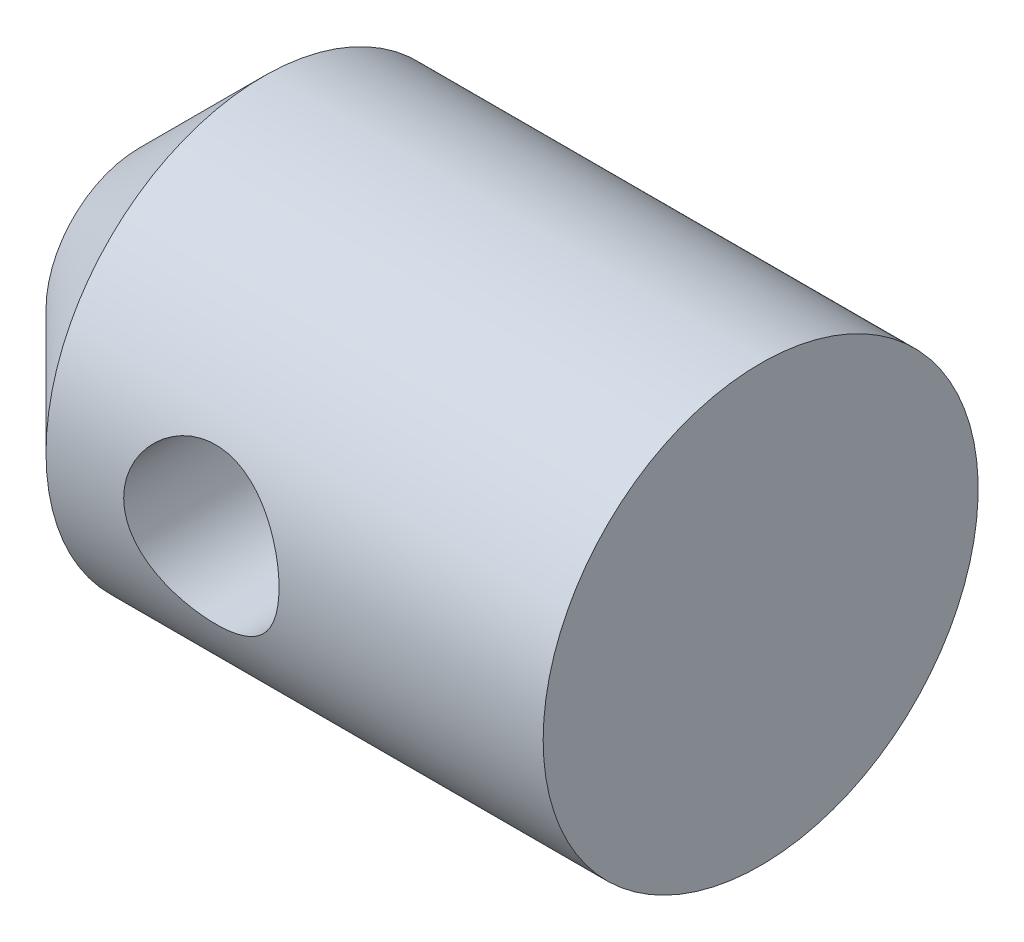
ISO-10303-21;
HEADER;
FILE_DESCRIPTION(('STEP AP214'),'2;1');
FILE_NAME('part.step','',(''),(''),'','','');
FILE_SCHEMA(('AUTOMOTIVE_DESIGN { 1 0 10303 214 1 1 1 1 }'));
ENDSEC;
DATA;
#1=APPLICATION_CONTEXT('core data for automotive mechanical design processes');
#2=APPLICATION_PROTOCOL_DEFINITION('international standard','automotive_design',2000,#1);
#3=PRODUCT_CONTEXT('',#1,'mechanical');
#4=PRODUCT('Part','Part','',(#3));
#5=PRODUCT_RELATED_PRODUCT_CATEGORY('part','',(#4));
#6=PRODUCT_DEFINITION_FORMATION('','',#4);
#7=PRODUCT_DEFINITION_CONTEXT('part definition',#1,'design');
#8=PRODUCT_DEFINITION('design','',#6,#7);
#9=PRODUCT_DEFINITION_SHAPE('','',#8);
#10=(LENGTH_UNIT() NAMED_UNIT(*) SI_UNIT(.MILLI.,.METRE.));
#11=(NAMED_UNIT(*) PLANE_ANGLE_UNIT() SI_UNIT($,.RADIAN.));
#12=(NAMED_UNIT(*) SI_UNIT($,.STERADIAN.) SOLID_ANGLE_UNIT());
#13=UNCERTAINTY_MEASURE_WITH_UNIT(LENGTH_MEASURE(1.E-05),#10,'distance_accuracy_value','');
#14=(GEOMETRIC_REPRESENTATION_CONTEXT(3) GLOBAL_UNCERTAINTY_ASSIGNED_CONTEXT((#13)) GLOBAL_UNIT_ASSIGNED_CONTEXT((#10,
#11,#12)) REPRESENTATION_CONTEXT('',''));
#15=CARTESIAN_POINT('',(0.,0.,0.));
#16=DIRECTION('',(0.,0.,1.));
#17=DIRECTION('',(1.,0.,0.));
#18=AXIS2_PLACEMENT_3D('',#15,#16,#17);
#19=CARTESIAN_POINT('',(3.99999999999998,0.,0.));
#20=DIRECTION('',(1.,0.,0.));
#21=DIRECTION('',(0.,0.,-1.));
#22=AXIS2_PLACEMENT_3D('',#19,#20,#21);
#23=CONICAL_SURFACE('',#22,7.,0.78539816339745);
#24=CARTESIAN_POINT('',(0.,0.,0.));
#25=DIRECTION('',(-1.,0.,0.));
#26=DIRECTION('',(0.,0.,1.));
#27=AXIS2_PLACEMENT_3D('',#24,#25,#26);
#28=CIRCLE('',#27,3.);
#29=CARTESIAN_POINT('',(0.,0.,3.));
#30=VERTEX_POINT('',#29);
#31=EDGE_CURVE('E10',#30,#30,#28,.T.);
#32=ORIENTED_EDGE('',*,*,#31,.F.);
#33=EDGE_LOOP('',(#32));
#34=FACE_BOUND('',#33,.T.);
#35=CARTESIAN_POINT('',(3.99999999999998,0.,0.));
#36=DIRECTION('',(-1.,0.,0.));
#37=DIRECTION('',(0.,0.,1.));
#38=AXIS2_PLACEMENT_3D('',#35,#36,#37);
#39=CIRCLE('',#38,7.);
#40=CARTESIAN_POINT('',(3.99999999999998,0.,7.));
#41=VERTEX_POINT('',#40);
#42=EDGE_CURVE('E47',#41,#41,#39,.T.);
#43=ORIENTED_EDGE('',*,*,#42,.T.);
#44=EDGE_LOOP('',(#43));
#45=FACE_BOUND('',#44,.T.);
#46=ADVANCED_FACE('F30',(#34,#45),#23,.T.);
#47=CARTESIAN_POINT('',(0.,3.,0.));
#48=DIRECTION('',(1.,0.,0.));
#49=DIRECTION('',(0.,0.,-1.));
#50=AXIS2_PLACEMENT_3D('',#47,#48,#49);
#51=PLANE('',#50);
#52=CARTESIAN_POINT('',(0.,0.,0.));
#53=DIRECTION('',(-1.,0.,0.));
#54=DIRECTION('',(0.,0.,1.));
#55=AXIS2_PLACEMENT_3D('',#52,#53,#54);
#56=CIRCLE('',#55,1.);
#57=CARTESIAN_POINT('',(0.,0.,1.));
#58=VERTEX_POINT('',#57);
#59=EDGE_CURVE('E97',#58,#58,#56,.T.);
#60=ORIENTED_EDGE('',*,*,#59,.F.);
#61=EDGE_LOOP('',(#60));
#62=FACE_BOUND('',#61,.T.);
#63=ORIENTED_EDGE('',*,*,#31,.T.);
#64=EDGE_LOOP('',(#63));
#65=FACE_BOUND('',#64,.T.);
#66=ADVANCED_FACE('F87',(#62,#65),#51,.F.);
#67=CARTESIAN_POINT('',(20.,0.,0.));
#68=DIRECTION('',(-1.,0.,0.));
#69=DIRECTION('',(0.,0.,1.));
#70=AXIS2_PLACEMENT_3D('',#67,#68,#69);
#71=PLANE('',#70);
#72=CARTESIAN_POINT('',(20.,0.,0.));
#73=DIRECTION('',(-1.,0.,0.));
#74=DIRECTION('',(0.,0.,1.));
#75=AXIS2_PLACEMENT_3D('',#72,#73,#74);
#76=CIRCLE('',#75,7.);
#77=CARTESIAN_POINT('',(20.,0.,7.));
#78=VERTEX_POINT('',#77);
#79=EDGE_CURVE('E42',#78,#78,#76,.T.);
#80=ORIENTED_EDGE('',*,*,#79,.F.);
#81=EDGE_LOOP('',(#80));
#82=FACE_BOUND('',#81,.T.);
#83=ADVANCED_FACE('F83',(#82),#71,.F.);
#84=CARTESIAN_POINT('',(0.,0.,0.));
#85=DIRECTION('',(-1.,0.,0.));
#86=DIRECTION('',(0.,0.,1.));
#87=AXIS2_PLACEMENT_3D('',#84,#85,#86);
#88=CYLINDRICAL_SURFACE('',#87,7.);
#89=CARTESIAN_POINT('',(11.5,0.,7.));
#90=CARTESIAN_POINT('',(11.5000028240418,-0.135839760518735,7.0000020295295));
#91=CARTESIAN_POINT('',(11.4888932427672,-0.271659429947531,6.99601056603649));
#92=CARTESIAN_POINT('',(11.4449087128079,-0.539264896606897,6.98048404948616));
#93=CARTESIAN_POINT('',(11.4120345949352,-0.671050847614628,6.96894928437749));
#94=CARTESIAN_POINT('',(11.3258148587325,-0.926692116674317,6.93958109810981));
#95=CARTESIAN_POINT('',(11.27250644028,-1.05056137145919,6.92175912724346));
#96=CARTESIAN_POINT('',(11.1471112806324,-1.28759585298401,6.88161078032354));
#97=CARTESIAN_POINT('',(11.075020040551,-1.40075850640075,6.85928332539979));
#98=CARTESIAN_POINT('',(10.9111568678836,-1.61758802805346,6.81147377429754));
#99=CARTESIAN_POINT('',(10.8187812689946,-1.72078015672851,6.78590827445072));
#100=CARTESIAN_POINT('',(10.6182536362102,-1.9105819932243,6.73493522536265));
#101=CARTESIAN_POINT('',(10.5100974162836,-1.99718728701346,6.70952771990193));
#102=CARTESIAN_POINT('',(10.2766022072243,-2.15423735561842,6.6608007016897));
#103=CARTESIAN_POINT('',(10.1508052564835,-2.2240352979483,6.63758107761794));
#104=CARTESIAN_POINT('',(9.88829633529564,-2.34127572230003,6.59714352451506));
#105=CARTESIAN_POINT('',(9.75158828543227,-2.38872619231546,6.57992345154766));
#106=CARTESIAN_POINT('',(9.47657716379751,-2.45809130448528,6.55432038222057));
#107=CARTESIAN_POINT('',(9.33853069305687,-2.48090519407331,6.54562733379002));
#108=CARTESIAN_POINT('',(9.06031636817618,-2.5031615222748,6.53715061879805));
#109=CARTESIAN_POINT('',(8.92014930745843,-2.50261249605974,6.53736369856128));
#110=CARTESIAN_POINT('',(8.64964434494749,-2.4788507897233,6.54640588297195));
#111=CARTESIAN_POINT('',(8.51918164700024,-2.45685161763648,6.55477363669039));
#112=CARTESIAN_POINT('',(8.26393847281664,-2.3928085105506,6.57842082174382));
#113=CARTESIAN_POINT('',(8.13915877534919,-2.35076183734614,6.59370119723067));
#114=CARTESIAN_POINT('',(7.89622625421427,-2.247095668441,6.62975170487814));
#115=CARTESIAN_POINT('',(7.77823039734145,-2.18514195933256,6.65061447775042));
#116=CARTESIAN_POINT('',(7.55394361335027,-2.04365272690694,6.69544469696369));
#117=CARTESIAN_POINT('',(7.44765646669257,-1.96411154980233,6.71941314064672));
#118=CARTESIAN_POINT('',(7.24304040862885,-1.78403149047107,6.76952498465894));
#119=CARTESIAN_POINT('',(7.14558214075083,-1.68251331515438,6.7957122347435));
#120=CARTESIAN_POINT('',(6.9688283171652,-1.46426184534914,6.84605473605515));
#121=CARTESIAN_POINT('',(6.88953505770122,-1.3475266301937,6.87020973014028));
#122=CARTESIAN_POINT('',(6.75051939006078,-1.10010034292175,6.91416998722002));
#123=CARTESIAN_POINT('',(6.6910617601102,-0.96924911242521,6.93391532170414));
#124=CARTESIAN_POINT('',(6.59528417583962,-0.698523468127248,6.96639167687355));
#125=CARTESIAN_POINT('',(6.55895493923736,-0.558652699053767,6.97912551125634));
#126=CARTESIAN_POINT('',(6.5120808493404,-0.281205091813834,6.99566202632136));
#127=CARTESIAN_POINT('',(6.50036186925433,-0.143850613169093,6.99987103999093));
#128=CARTESIAN_POINT('',(6.49965487800976,0.130909371573393,7.00012297890716));
#129=CARTESIAN_POINT('',(6.5106623730082,0.26831486221267,6.99616751856457));
#130=CARTESIAN_POINT('',(6.55418613732156,0.534368698997769,6.98080349995239));
#131=CARTESIAN_POINT('',(6.58595475579813,0.663155848081399,6.96965417819419));
#132=CARTESIAN_POINT('',(6.66913659473604,0.913499444029993,6.94128245796678));
#133=CARTESIAN_POINT('',(6.72055236582855,1.03505494970017,6.9240592709991));
#134=CARTESIAN_POINT('',(6.84315885340159,1.27131790851501,6.88465739573328));
#135=CARTESIAN_POINT('',(6.91486648049935,1.38573546298722,6.86235262462323));
#136=CARTESIAN_POINT('',(7.07542749510743,1.6012793689737,6.81528395513799));
#137=CARTESIAN_POINT('',(7.16428676477382,1.70240114063959,6.79051921453451));
#138=CARTESIAN_POINT('',(7.3621296327289,1.89402292059753,6.73966040960453));
#139=CARTESIAN_POINT('',(7.47192471301965,1.98368681906969,6.71356479866296));
#140=CARTESIAN_POINT('',(7.70554127000433,2.14345525781598,6.6642787599771));
#141=CARTESIAN_POINT('',(7.82936343112859,2.21355884309556,6.64108847411013));
#142=CARTESIAN_POINT('',(8.08806480923604,2.33208686094212,6.60040332956606));
#143=CARTESIAN_POINT('',(8.22295567050984,2.3804881075604,6.58291456759544));
#144=CARTESIAN_POINT('',(8.49976010072008,2.45361419016747,6.55601442004241));
#145=CARTESIAN_POINT('',(8.6416698206623,2.4783518546378,6.54659865821928));
#146=CARTESIAN_POINT('',(8.91952047937298,2.50236255506862,6.53745596427834));
#147=CARTESIAN_POINT('',(9.05532321442439,2.50304426978182,6.53719306756498));
#148=CARTESIAN_POINT('',(9.32499767065487,2.48247035008869,6.54503319463772));
#149=CARTESIAN_POINT('',(9.45886954124813,2.46121642244208,6.55313556754228));
#150=CARTESIAN_POINT('',(9.71750058537184,2.39843007607193,6.57636700427785));
#151=CARTESIAN_POINT('',(9.84240409900577,2.35741961008936,6.59131474248996));
#152=CARTESIAN_POINT('',(10.0836426818669,2.25672644338171,6.62646329315119));
#153=CARTESIAN_POINT('',(10.1999756809442,2.19703924956895,6.64666536944648));
#154=CARTESIAN_POINT('',(10.4269257499522,2.05730313071904,6.69127230994832));
#155=CARTESIAN_POINT('',(10.5369880408629,1.97640371595173,6.71583400336863));
#156=CARTESIAN_POINT('',(10.7424275046605,1.79790863011924,6.76580411328317));
#157=CARTESIAN_POINT('',(10.837800220351,1.70030791033581,6.79121278393859));
#158=CARTESIAN_POINT('',(11.0157219028165,1.48566252339524,6.84145445667706));
#159=CARTESIAN_POINT('',(11.0974530397909,1.36791750616705,6.86620367070764));
#160=CARTESIAN_POINT('',(11.2399076638379,1.11951131249464,6.91104924401845));
#161=CARTESIAN_POINT('',(11.3006327402027,0.988851114158938,6.93114595526313));
#162=CARTESIAN_POINT('',(11.3991403103086,0.717646336524984,6.96446006180832));
#163=CARTESIAN_POINT('',(11.4368254081626,0.577062560467784,6.97764821973896));
#164=CARTESIAN_POINT('',(11.4872488746388,0.290976881134822,6.99541542277591));
#165=CARTESIAN_POINT('',(11.4999969756063,0.145476919097827,6.99999782648543));
#166=CARTESIAN_POINT('',(11.5,0.,7.));
#167=B_SPLINE_CURVE_WITH_KNOTS('',3,(#89,#90,#91,#92,#93,#94,#95,#96,#97,#98,#99,#100,#101,#102,
#103,#104,#105,#106,#107,#108,#109,#110,#111,#112,#113,#114,#115,#116,#117,#118,#119,#120,#121,
#122,#123,#124,#125,#126,#127,#128,#129,#130,#131,#132,#133,#134,#135,#136,#137,#138,#139,#140,
#141,#142,#143,#144,#145,#146,#147,#148,#149,#150,#151,#152,#153,#154,#155,#156,#157,#158,#159,
#160,#161,#162,#163,#164,#165,#166),.UNSPECIFIED.,.T.,.F.,(4,2,2,2,2,2,2,2,2,2,2,2,2,2,2,2,2,2,
2,2,2,2,2,2,2,2,2,2,2,2,2,2,2,2,2,2,2,2,4),(0.,0.406983217142953,0.813950899519932,
1.22018120425629,1.62650889940498,2.04714572459521,2.46789433314937,2.90289606780334,
3.3377421950035,3.75611562378725,4.17433620956451,4.57019246497947,4.96610280426156,
5.36904149669469,5.77210990935867,6.19956653135137,6.62707715847137,7.06008524763626,
7.49291944485573,7.90458529912081,8.31616976000825,8.71369326802826,9.11126840085791,
9.52005856953122,9.92898918269314,10.3593838463852,10.7897995195909,11.2206739431307,
11.6513146487841,12.0566930957309,12.4620400035307,12.8572208236401,13.2524967861626,
13.6670344525245,14.0816976535747,14.5159343578492,14.9501382011315,15.3861650682914,
15.8220217300551),.UNSPECIFIED.);
#168=CARTESIAN_POINT('',(11.5,0.,7.));
#169=VERTEX_POINT('',#168);
#170=EDGE_CURVE('E69',#169,#169,#167,.T.);
#171=ORIENTED_EDGE('',*,*,#170,.T.);
#172=EDGE_LOOP('',(#171));
#173=FACE_BOUND('',#172,.T.);
#174=CARTESIAN_POINT('',(11.5,0.,-7.));
#175=CARTESIAN_POINT('',(11.5000028240418,0.135839760518735,-7.0000020295295));
#176=CARTESIAN_POINT('',(11.4888932427672,0.271659429947531,-6.99601056603649));
#177=CARTESIAN_POINT('',(11.4449087128079,0.539264896606897,-6.98048404948616));
#178=CARTESIAN_POINT('',(11.4120345949352,0.671050847614628,-6.96894928437749));
#179=CARTESIAN_POINT('',(11.3258148587325,0.926692116674317,-6.93958109810981));
#180=CARTESIAN_POINT('',(11.27250644028,1.05056137145919,-6.92175912724346));
#181=CARTESIAN_POINT('',(11.1471112806324,1.28759585298401,-6.88161078032354));
#182=CARTESIAN_POINT('',(11.075020040551,1.40075850640075,-6.85928332539979));
#183=CARTESIAN_POINT('',(10.9111568678836,1.61758802805346,-6.81147377429754));
#184=CARTESIAN_POINT('',(10.8187812689946,1.72078015672851,-6.78590827445072));
#185=CARTESIAN_POINT('',(10.6182536362102,1.9105819932243,-6.73493522536265));
#186=CARTESIAN_POINT('',(10.5100974162836,1.99718728701346,-6.70952771990193));
#187=CARTESIAN_POINT('',(10.2766022072243,2.15423735561842,-6.6608007016897));
#188=CARTESIAN_POINT('',(10.1508052564835,2.2240352979483,-6.63758107761794));
#189=CARTESIAN_POINT('',(9.88829633529564,2.34127572230003,-6.59714352451506));
#190=CARTESIAN_POINT('',(9.75158828543227,2.38872619231546,-6.57992345154766));
#191=CARTESIAN_POINT('',(9.47657716379751,2.45809130448528,-6.55432038222057));
#192=CARTESIAN_POINT('',(9.33853069305687,2.48090519407331,-6.54562733379002));
#193=CARTESIAN_POINT('',(9.06031636817618,2.5031615222748,-6.53715061879805));
#194=CARTESIAN_POINT('',(8.92014930745843,2.50261249605974,-6.53736369856128));
#195=CARTESIAN_POINT('',(8.64964434494749,2.4788507897233,-6.54640588297195));
#196=CARTESIAN_POINT('',(8.51918164700024,2.45685161763648,-6.55477363669039));
#197=CARTESIAN_POINT('',(8.26393847281664,2.3928085105506,-6.57842082174382));
#198=CARTESIAN_POINT('',(8.13915877534919,2.35076183734614,-6.59370119723067));
#199=CARTESIAN_POINT('',(7.89622625421427,2.247095668441,-6.62975170487814));
#200=CARTESIAN_POINT('',(7.77823039734145,2.18514195933256,-6.65061447775042));
#201=CARTESIAN_POINT('',(7.55394361335027,2.04365272690694,-6.69544469696369));
#202=CARTESIAN_POINT('',(7.44765646669257,1.96411154980233,-6.71941314064672));
#203=CARTESIAN_POINT('',(7.24304040862885,1.78403149047107,-6.76952498465894));
#204=CARTESIAN_POINT('',(7.14558214075083,1.68251331515438,-6.7957122347435));
#205=CARTESIAN_POINT('',(6.9688283171652,1.46426184534914,-6.84605473605515));
#206=CARTESIAN_POINT('',(6.88953505770122,1.3475266301937,-6.87020973014028));
#207=CARTESIAN_POINT('',(6.75051939006078,1.10010034292175,-6.91416998722002));
#208=CARTESIAN_POINT('',(6.6910617601102,0.96924911242521,-6.93391532170414));
#209=CARTESIAN_POINT('',(6.59528417583962,0.698523468127248,-6.96639167687355));
#210=CARTESIAN_POINT('',(6.55895493923736,0.558652699053767,-6.97912551125634));
#211=CARTESIAN_POINT('',(6.5120808493404,0.281205091813834,-6.99566202632136));
#212=CARTESIAN_POINT('',(6.50036186925433,0.143850613169093,-6.99987103999093));
#213=CARTESIAN_POINT('',(6.49965487800976,-0.130909371573393,-7.00012297890716));
#214=CARTESIAN_POINT('',(6.5106623730082,-0.26831486221267,-6.99616751856457));
#215=CARTESIAN_POINT('',(6.55418613732156,-0.534368698997769,-6.98080349995239));
#216=CARTESIAN_POINT('',(6.58595475579813,-0.663155848081399,-6.96965417819419));
#217=CARTESIAN_POINT('',(6.66913659473604,-0.913499444029993,-6.94128245796678));
#218=CARTESIAN_POINT('',(6.72055236582855,-1.03505494970017,-6.9240592709991));
#219=CARTESIAN_POINT('',(6.84315885340159,-1.27131790851501,-6.88465739573328));
#220=CARTESIAN_POINT('',(6.91486648049935,-1.38573546298722,-6.86235262462323));
#221=CARTESIAN_POINT('',(7.07542749510743,-1.6012793689737,-6.81528395513799));
#222=CARTESIAN_POINT('',(7.16428676477382,-1.70240114063959,-6.79051921453451));
#223=CARTESIAN_POINT('',(7.3621296327289,-1.89402292059753,-6.73966040960453));
#224=CARTESIAN_POINT('',(7.47192471301965,-1.98368681906969,-6.71356479866296));
#225=CARTESIAN_POINT('',(7.70554127000433,-2.14345525781598,-6.6642787599771));
#226=CARTESIAN_POINT('',(7.82936343112859,-2.21355884309556,-6.64108847411013));
#227=CARTESIAN_POINT('',(8.08806480923604,-2.33208686094212,-6.60040332956606));
#228=CARTESIAN_POINT('',(8.22295567050984,-2.3804881075604,-6.58291456759544));
#229=CARTESIAN_POINT('',(8.49976010072008,-2.45361419016747,-6.55601442004241));
#230=CARTESIAN_POINT('',(8.6416698206623,-2.4783518546378,-6.54659865821928));
#231=CARTESIAN_POINT('',(8.91952047937298,-2.50236255506862,-6.53745596427834));
#232=CARTESIAN_POINT('',(9.05532321442439,-2.50304426978182,-6.53719306756498));
#233=CARTESIAN_POINT('',(9.32499767065487,-2.48247035008869,-6.54503319463772));
#234=CARTESIAN_POINT('',(9.45886954124813,-2.46121642244208,-6.55313556754228));
#235=CARTESIAN_POINT('',(9.71750058537184,-2.39843007607193,-6.57636700427785));
#236=CARTESIAN_POINT('',(9.84240409900577,-2.35741961008936,-6.59131474248996));
#237=CARTESIAN_POINT('',(10.0836426818669,-2.25672644338171,-6.62646329315119));
#238=CARTESIAN_POINT('',(10.1999756809442,-2.19703924956895,-6.64666536944648));
#239=CARTESIAN_POINT('',(10.4269257499522,-2.05730313071904,-6.69127230994832));
#240=CARTESIAN_POINT('',(10.5369880408629,-1.97640371595173,-6.71583400336863));
#241=CARTESIAN_POINT('',(10.7424275046605,-1.79790863011924,-6.76580411328317));
#242=CARTESIAN_POINT('',(10.837800220351,-1.70030791033581,-6.79121278393859));
#243=CARTESIAN_POINT('',(11.0157219028165,-1.48566252339524,-6.84145445667706));
#244=CARTESIAN_POINT('',(11.0974530397909,-1.36791750616705,-6.86620367070764));
#245=CARTESIAN_POINT('',(11.2399076638379,-1.11951131249464,-6.91104924401845));
#246=CARTESIAN_POINT('',(11.3006327402027,-0.988851114158938,-6.93114595526313));
#247=CARTESIAN_POINT('',(11.3991403103086,-0.717646336524984,-6.96446006180832));
#248=CARTESIAN_POINT('',(11.4368254081626,-0.577062560467784,-6.97764821973896));
#249=CARTESIAN_POINT('',(11.4872488746388,-0.290976881134822,-6.99541542277591));
#250=CARTESIAN_POINT('',(11.4999969756063,-0.145476919097827,-6.99999782648543));
#251=CARTESIAN_POINT('',(11.5,0.,-7.));
#252=B_SPLINE_CURVE_WITH_KNOTS('',3,(#174,#175,#176,#177,#178,#179,#180,#181,#182,#183,#184,
#185,#186,#187,#188,#189,#190,#191,#192,#193,#194,#195,#196,#197,#198,#199,#200,#201,#202,#203,
#204,#205,#206,#207,#208,#209,#210,#211,#212,#213,#214,#215,#216,#217,#218,#219,#220,#221,#222,
#223,#224,#225,#226,#227,#228,#229,#230,#231,#232,#233,#234,#235,#236,#237,#238,#239,#240,#241,
#242,#243,#244,#245,#246,#247,#248,#249,#250,#251),.UNSPECIFIED.,.T.,.F.,(4,2,2,2,2,2,2,2,2,2,2,
2,2,2,2,2,2,2,2,2,2,2,2,2,2,2,2,2,2,2,2,2,2,2,2,2,2,2,4),(0.,0.406983217142953,
0.813950899519932,1.22018120425629,1.62650889940498,2.04714572459521,2.46789433314937,
2.90289606780334,3.3377421950035,3.75611562378725,4.17433620956451,4.57019246497947,
4.96610280426156,5.36904149669469,5.77210990935867,6.19956653135137,6.62707715847137,
7.06008524763626,7.49291944485573,7.90458529912081,8.31616976000825,8.71369326802826,
9.11126840085791,9.52005856953122,9.92898918269314,10.3593838463852,10.7897995195909,
11.2206739431307,11.6513146487841,12.0566930957309,12.4620400035307,12.8572208236401,
13.2524967861626,13.6670344525245,14.0816976535747,14.5159343578492,14.9501382011315,
15.3861650682914,15.8220217300551),.UNSPECIFIED.);
#253=CARTESIAN_POINT('',(11.5,0.,-7.));
#254=VERTEX_POINT('',#253);
#255=EDGE_CURVE('E74',#254,#254,#252,.T.);
#256=ORIENTED_EDGE('',*,*,#255,.T.);
#257=EDGE_LOOP('',(#256));
#258=FACE_BOUND('',#257,.T.);
#259=ORIENTED_EDGE('',*,*,#42,.F.);
#260=EDGE_LOOP('',(#259));
#261=FACE_BOUND('',#260,.T.);
#262=ORIENTED_EDGE('',*,*,#79,.T.);
#263=EDGE_LOOP('',(#262));
#264=FACE_BOUND('',#263,.T.);
#265=ADVANCED_FACE('F79',(#173,#258,#261,#264),#88,.T.);
#266=CARTESIAN_POINT('',(15.,0.,0.));
#267=DIRECTION('',(-1.,0.,0.));
#268=DIRECTION('',(0.,0.,1.));
#269=AXIS2_PLACEMENT_3D('',#266,#267,#268);
#270=CYLINDRICAL_SURFACE('',#269,1.);
#271=CARTESIAN_POINT('',(6.49999999999998,0.,1.));
#272=CARTESIAN_POINT('',(6.50000364386456,-0.0537465027214457,0.999995074088137));
#273=CARTESIAN_POINT('',(6.50175352846532,-0.107586282045337,0.995641123955812));
#274=CARTESIAN_POINT('',(6.50858273449677,-0.213748240208948,0.978376148239382));
#275=CARTESIAN_POINT('',(6.51367110650559,-0.266065888780624,0.965441860456933));
#276=CARTESIAN_POINT('',(6.52662895393439,-0.367476961363701,0.931561960970584));
#277=CARTESIAN_POINT('',(6.53448931817962,-0.416580330808479,0.910642576891635));
#278=CARTESIAN_POINT('',(6.55221694601959,-0.510535985164184,0.861490413336727));
#279=CARTESIAN_POINT('',(6.5620835127097,-0.555389738375496,0.833260172540535));
#280=CARTESIAN_POINT('',(6.58334556914789,-0.641750503785197,0.768882250719531));
#281=CARTESIAN_POINT('',(6.59478851535403,-0.683031136275106,0.732446671879868));
#282=CARTESIAN_POINT('',(6.61769711546901,-0.759087502392361,0.653299998261611));
#283=CARTESIAN_POINT('',(6.62916277773102,-0.793860053566766,0.610585851394129));
#284=CARTESIAN_POINT('',(6.6513860410143,-0.857437283646439,0.517785964878867));
#285=CARTESIAN_POINT('',(6.66208942017522,-0.885907490597737,0.467456756988401));
#286=CARTESIAN_POINT('',(6.68083176406602,-0.933877359518574,0.362231800789979));
#287=CARTESIAN_POINT('',(6.6888719937791,-0.953381282142917,0.30733823607582));
#288=CARTESIAN_POINT('',(6.70086821169589,-0.981949411697934,0.197143833203949));
#289=CARTESIAN_POINT('',(6.70499289822196,-0.991446982902824,0.141974382211893));
#290=CARTESIAN_POINT('',(6.70917997975426,-1.00108648082001,0.030682500846366));
#291=CARTESIAN_POINT('',(6.70924437238614,-1.00123300815661,-0.0254394473125076));
#292=CARTESIAN_POINT('',(6.70544749860001,-0.992494683752272,-0.132878335729022));
#293=CARTESIAN_POINT('',(6.70185912480773,-0.984237657152568,-0.184257857204515));
#294=CARTESIAN_POINT('',(6.6916190619608,-0.95997344014891,-0.284829778003357));
#295=CARTESIAN_POINT('',(6.68496683839162,-0.943964897402315,-0.334021794055154));
#296=CARTESIAN_POINT('',(6.66920257455733,-0.904347366275536,-0.430008918098021));
#297=CARTESIAN_POINT('',(6.66004310359604,-0.880589931157658,-0.476734619527345));
#298=CARTESIAN_POINT('',(6.64030941805053,-0.826253230366107,-0.565707908180782));
#299=CARTESIAN_POINT('',(6.62973467271574,-0.795671402550422,-0.607953804701403));
#300=CARTESIAN_POINT('',(6.60736631628863,-0.725775299727216,-0.690204864400999));
#301=CARTESIAN_POINT('',(6.59554167511922,-0.685968731485317,-0.729784364723008));
#302=CARTESIAN_POINT('',(6.57270087520857,-0.600157213715096,-0.80184223900102));
#303=CARTESIAN_POINT('',(6.56168487777336,-0.554151032667216,-0.834319198705147));
#304=CARTESIAN_POINT('',(6.54142659367724,-0.456038826302921,-0.891808723707917));
#305=CARTESIAN_POINT('',(6.53222364952291,-0.403830245673238,-0.916661140598527));
#306=CARTESIAN_POINT('',(6.51692585835619,-0.29551188274144,-0.957083930539028));
#307=CARTESIAN_POINT('',(6.51082943268807,-0.239404098424837,-0.972659018778705));
#308=CARTESIAN_POINT('',(6.50271930246543,-0.12844794380391,-0.993224147709852));
#309=CARTESIAN_POINT('',(6.50048527083241,-0.073721646992767,-0.99878622712678));
#310=CARTESIAN_POINT('',(6.49965760744683,0.0359226549039089,-1.00085655026431));
#311=CARTESIAN_POINT('',(6.50106303208852,0.0908406066119622,-0.997367140773755));
#312=CARTESIAN_POINT('',(6.50721216468122,0.196716369560994,-0.981854123724004));
#313=CARTESIAN_POINT('',(6.51180304327236,0.247741245887737,-0.970221009824512));
#314=CARTESIAN_POINT('',(6.52370279297248,0.34706771403039,-0.939282145845093));
#315=CARTESIAN_POINT('',(6.53101201321733,0.395368955112423,-0.91997541016566));
#316=CARTESIAN_POINT('',(6.54791702614592,0.489539392908351,-0.873607530160025));
#317=CARTESIAN_POINT('',(6.55757592010096,0.535289011377703,-0.846327263978426));
#318=CARTESIAN_POINT('',(6.57813317627236,0.621721795623278,-0.785029838047178));
#319=CARTESIAN_POINT('',(6.58903203444863,0.662402920380563,-0.751009978538693));
#320=CARTESIAN_POINT('',(6.61177441180942,0.740361521514409,-0.674564993525186));
#321=CARTESIAN_POINT('',(6.62363279287472,0.777236966903032,-0.631733229246896));
#322=CARTESIAN_POINT('',(6.64629163541432,0.843375598706856,-0.540279958495316));
#323=CARTESIAN_POINT('',(6.65709192236743,0.872637530668755,-0.491657499830025));
#324=CARTESIAN_POINT('',(6.67642850046144,0.922903750965814,-0.389269152702947));
#325=CARTESIAN_POINT('',(6.68494184557604,0.943825297267227,-0.335458000393844));
#326=CARTESIAN_POINT('',(6.69838163261032,0.976148109852652,-0.224633174142422));
#327=CARTESIAN_POINT('',(6.70331072151999,0.987556402634658,-0.167621897093787));
#328=CARTESIAN_POINT('',(6.70864120350035,0.999857808639201,-0.0564360491127282));
#329=CARTESIAN_POINT('',(6.70934289495912,1.00144854115143,-0.00235258020332416));
#330=CARTESIAN_POINT('',(6.70692581983449,0.995901579638762,0.105272428856647));
#331=CARTESIAN_POINT('',(6.70380753837601,0.988764993956891,0.158814036951292));
#332=CARTESIAN_POINT('',(6.69436675460488,0.966535683076824,0.261666094927521));
#333=CARTESIAN_POINT('',(6.68817584086273,0.951768746785489,0.3110601372165));
#334=CARTESIAN_POINT('',(6.6733799938365,0.915002724245506,0.406689314806741));
#335=CARTESIAN_POINT('',(6.66477439396995,0.893001640696907,0.452923573449913));
#336=CARTESIAN_POINT('',(6.64550695197752,0.840936381379865,0.543804809635389));
#337=CARTESIAN_POINT('',(6.63475558843377,0.810482667579745,0.588209335065242));
#338=CARTESIAN_POINT('',(6.61268097813879,0.742946059635748,0.671496658601878));
#339=CARTESIAN_POINT('',(6.60135755975795,0.70586116740906,0.710377786064158));
#340=CARTESIAN_POINT('',(6.57853216456301,0.623252753136231,0.784101426631808));
#341=CARTESIAN_POINT('',(6.56706621018905,0.577338000573069,0.818518653449034));
#342=CARTESIAN_POINT('',(6.5459979664314,0.479950160142889,0.879168521310818));
#343=CARTESIAN_POINT('',(6.53639654453545,0.428474502273618,0.905397356076264));
#344=CARTESIAN_POINT('',(6.52030142592067,0.322369031247602,0.948311107595145));
#345=CARTESIAN_POINT('',(6.51375318472484,0.267815809109848,0.965164661780169));
#346=CARTESIAN_POINT('',(6.50427846895315,0.156438273140611,0.989319560477133));
#347=CARTESIAN_POINT('',(6.50134050252179,0.0996217629294565,0.99665121837195));
#348=CARTESIAN_POINT('',(6.5001205024793,0.0284561489454649,0.999697690489137));
#349=CARTESIAN_POINT('',(6.4999990351541,0.0142313443703792,1.0000013043146));
#350=CARTESIAN_POINT('',(6.49999999999998,0.,1.));
#351=B_SPLINE_CURVE_WITH_KNOTS('',3,(#271,#272,#273,#274,#275,#276,#277,#278,#279,#280,#281,
#282,#283,#284,#285,#286,#287,#288,#289,#290,#291,#292,#293,#294,#295,#296,#297,#298,#299,#300,
#301,#302,#303,#304,#305,#306,#307,#308,#309,#310,#311,#312,#313,#314,#315,#316,#317,#318,#319,
#320,#321,#322,#323,#324,#325,#326,#327,#328,#329,#330,#331,#332,#333,#334,#335,#336,#337,#338,
#339,#340,#341,#342,#343,#344,#345,#346,#347,#348,#349,#350),.UNSPECIFIED.,.T.,.F.,(4,2,2,2,2,2,
2,2,2,2,2,2,2,2,2,2,2,2,2,2,2,2,2,2,2,2,2,2,2,2,2,2,2,2,2,2,2,2,2,4),(0.,0.161201493946535,
0.322841818003967,0.48395572873579,0.645013767839921,0.812986908501985,0.981041974672057,
1.15657629409608,1.33202711559134,1.49952052654414,1.66693153170244,1.82269164200686,
1.97847893628024,2.13744563149408,2.29647210969092,2.46779174593278,2.63914546419866,
2.81388456581403,2.98853478056895,3.15284592264004,3.31711446785041,3.47400227782183,
3.63091024496898,3.79261756699131,3.95438979749484,4.12684237312207,4.29932334521874,
4.47347522570414,4.64749836322967,4.80899836696374,4.97047786281523,5.12557159274385,
5.28070817902581,5.44472734028346,5.60879600674197,5.78350211766918,5.95828931820266,
6.12982150506659,6.30080626202171,6.34349022948398),.UNSPECIFIED.);
#352=CARTESIAN_POINT('',(6.49999999999998,0.,1.));
#353=VERTEX_POINT('',#352);
#354=EDGE_CURVE('E50',#353,#353,#351,.T.);
#355=ORIENTED_EDGE('',*,*,#354,.T.);
#356=EDGE_LOOP('',(#355));
#357=FACE_BOUND('',#356,.T.);
#358=ORIENTED_EDGE('',*,*,#59,.T.);
#359=EDGE_LOOP('',(#358));
#360=FACE_BOUND('',#359,.T.);
#361=ADVANCED_FACE('F55',(#357,#360),#270,.F.);
#362=CARTESIAN_POINT('',(8.99999999999998,0.,-7.));
#363=DIRECTION('',(0.,0.,1.));
#364=DIRECTION('',(1.,0.,0.));
#365=AXIS2_PLACEMENT_3D('',#362,#363,#364);
#366=CYLINDRICAL_SURFACE('',#365,2.5);
#367=CARTESIAN_POINT('',(11.5,0.,1.));
#368=CARTESIAN_POINT('',(11.4999963561354,0.0537465027214456,0.999995074088137));
#369=CARTESIAN_POINT('',(11.4982464715346,0.107586282045337,0.995641123955812));
#370=CARTESIAN_POINT('',(11.4914172655032,0.213748240208948,0.978376148239382));
#371=CARTESIAN_POINT('',(11.4863288934944,0.266065888780624,0.965441860456933));
#372=CARTESIAN_POINT('',(11.4733710460656,0.367476961363702,0.931561960970584));
#373=CARTESIAN_POINT('',(11.4655106818203,0.41658033080848,0.910642576891635));
#374=CARTESIAN_POINT('',(11.4477830539804,0.510535985164184,0.861490413336727));
#375=CARTESIAN_POINT('',(11.4379164872903,0.555389738375496,0.833260172540535));
#376=CARTESIAN_POINT('',(11.4166544308521,0.641750503785197,0.768882250719531));
#377=CARTESIAN_POINT('',(11.4052114846459,0.683031136275107,0.732446671879868));
#378=CARTESIAN_POINT('',(11.382302884531,0.759087502392361,0.653299998261611));
#379=CARTESIAN_POINT('',(11.3708372222689,0.793860053566766,0.610585851394129));
#380=CARTESIAN_POINT('',(11.3486139589857,0.857437283646439,0.517785964878867));
#381=CARTESIAN_POINT('',(11.3379105798247,0.885907490597737,0.467456756988401));
#382=CARTESIAN_POINT('',(11.3191682359339,0.933877359518574,0.362231800789979));
#383=CARTESIAN_POINT('',(11.3111280062209,0.953381282142917,0.30733823607582));
#384=CARTESIAN_POINT('',(11.2991317883041,0.981949411697933,0.197143833203949));
#385=CARTESIAN_POINT('',(11.295007101778,0.991446982902824,0.141974382211894));
#386=CARTESIAN_POINT('',(11.2908200202457,1.00108648082001,0.0306825008463661));
#387=CARTESIAN_POINT('',(11.2907556276138,1.00123300815661,-0.0254394473125076));
#388=CARTESIAN_POINT('',(11.2945525014,0.992494683752272,-0.132878335729022));
#389=CARTESIAN_POINT('',(11.2981408751922,0.984237657152568,-0.184257857204515));
#390=CARTESIAN_POINT('',(11.3083809380392,0.95997344014891,-0.284829778003357));
#391=CARTESIAN_POINT('',(11.3150331616083,0.943964897402315,-0.334021794055154));
#392=CARTESIAN_POINT('',(11.3307974254426,0.904347366275536,-0.430008918098021));
#393=CARTESIAN_POINT('',(11.3399568964039,0.880589931157658,-0.476734619527345));
#394=CARTESIAN_POINT('',(11.3596905819494,0.826253230366107,-0.565707908180782));
#395=CARTESIAN_POINT('',(11.3702653272842,0.795671402550422,-0.607953804701403));
#396=CARTESIAN_POINT('',(11.3926336837113,0.725775299727217,-0.690204864400999));
#397=CARTESIAN_POINT('',(11.4044583248807,0.685968731485317,-0.729784364723008));
#398=CARTESIAN_POINT('',(11.4272991247914,0.600157213715096,-0.801842239001019));
#399=CARTESIAN_POINT('',(11.4383151222266,0.554151032667217,-0.834319198705146));
#400=CARTESIAN_POINT('',(11.4585734063227,0.456038826302921,-0.891808723707916));
#401=CARTESIAN_POINT('',(11.4677763504771,0.403830245673239,-0.916661140598526));
#402=CARTESIAN_POINT('',(11.4830741416438,0.295511882741441,-0.957083930539028));
#403=CARTESIAN_POINT('',(11.4891705673119,0.239404098424837,-0.972659018778705));
#404=CARTESIAN_POINT('',(11.4972806975345,0.12844794380391,-0.993224147709852));
#405=CARTESIAN_POINT('',(11.4995147291675,0.0737216469927673,-0.99878622712678));
#406=CARTESIAN_POINT('',(11.5003423925531,-0.0359226549039087,-1.00085655026431));
#407=CARTESIAN_POINT('',(11.4989369679114,-0.0908406066119619,-0.997367140773755));
#408=CARTESIAN_POINT('',(11.4927878353187,-0.196716369560994,-0.981854123724004));
#409=CARTESIAN_POINT('',(11.4881969567276,-0.247741245887737,-0.970221009824512));
#410=CARTESIAN_POINT('',(11.4762972070275,-0.34706771403039,-0.939282145845093));
#411=CARTESIAN_POINT('',(11.4689879867826,-0.395368955112422,-0.91997541016566));
#412=CARTESIAN_POINT('',(11.452082973854,-0.489539392908351,-0.873607530160026));
#413=CARTESIAN_POINT('',(11.442424079899,-0.535289011377703,-0.846327263978427));
#414=CARTESIAN_POINT('',(11.4218668237276,-0.621721795623278,-0.785029838047178));
#415=CARTESIAN_POINT('',(11.4109679655513,-0.662402920380563,-0.751009978538693));
#416=CARTESIAN_POINT('',(11.3882255881905,-0.74036152151441,-0.674564993525186));
#417=CARTESIAN_POINT('',(11.3763672071252,-0.777236966903032,-0.631733229246896));
#418=CARTESIAN_POINT('',(11.3537083645856,-0.843375598706855,-0.540279958495316));
#419=CARTESIAN_POINT('',(11.3429080776325,-0.872637530668754,-0.491657499830026));
#420=CARTESIAN_POINT('',(11.3235714995385,-0.922903750965814,-0.389269152702948));
#421=CARTESIAN_POINT('',(11.3150581544239,-0.943825297267227,-0.335458000393845));
#422=CARTESIAN_POINT('',(11.3016183673896,-0.976148109852652,-0.224633174142422));
#423=CARTESIAN_POINT('',(11.29668927848,-0.987556402634658,-0.167621897093787));
#424=CARTESIAN_POINT('',(11.2913587964996,-0.999857808639201,-0.0564360491127283));
#425=CARTESIAN_POINT('',(11.2906571050408,-1.00144854115143,-0.00235258020332426));
#426=CARTESIAN_POINT('',(11.2930741801655,-0.995901579638762,0.105272428856647));
#427=CARTESIAN_POINT('',(11.2961924616239,-0.988764993956891,0.158814036951292));
#428=CARTESIAN_POINT('',(11.3056332453951,-0.966535683076824,0.261666094927521));
#429=CARTESIAN_POINT('',(11.3118241591372,-0.951768746785489,0.311060137216499));
#430=CARTESIAN_POINT('',(11.3266200061635,-0.915002724245506,0.406689314806741));
#431=CARTESIAN_POINT('',(11.33522560603,-0.893001640696907,0.452923573449913));
#432=CARTESIAN_POINT('',(11.3544930480224,-0.840936381379865,0.543804809635388));
#433=CARTESIAN_POINT('',(11.3652444115662,-0.810482667579745,0.588209335065242));
#434=CARTESIAN_POINT('',(11.3873190218612,-0.742946059635747,0.671496658601878));
#435=CARTESIAN_POINT('',(11.398642440242,-0.70586116740906,0.710377786064158));
#436=CARTESIAN_POINT('',(11.4214678354369,-0.623252753136231,0.784101426631808));
#437=CARTESIAN_POINT('',(11.4329337898109,-0.577338000573069,0.818518653449034));
#438=CARTESIAN_POINT('',(11.4540020335686,-0.479950160142889,0.879168521310818));
#439=CARTESIAN_POINT('',(11.4636034554645,-0.428474502273619,0.905397356076264));
#440=CARTESIAN_POINT('',(11.4796985740793,-0.322369031247601,0.948311107595145));
#441=CARTESIAN_POINT('',(11.4862468152751,-0.267815809109848,0.965164661780169));
#442=CARTESIAN_POINT('',(11.4957215310468,-0.156438273140611,0.989319560477133));
#443=CARTESIAN_POINT('',(11.4986594974782,-0.0996217629294565,0.99665121837195));
#444=CARTESIAN_POINT('',(11.4998794975207,-0.0284561489454649,0.999697690489137));
#445=CARTESIAN_POINT('',(11.5000009648459,-0.0142313443703792,1.0000013043146));
#446=CARTESIAN_POINT('',(11.5,0.,1.));
#447=B_SPLINE_CURVE_WITH_KNOTS('',3,(#367,#368,#369,#370,#371,#372,#373,#374,#375,#376,#377,
#378,#379,#380,#381,#382,#383,#384,#385,#386,#387,#388,#389,#390,#391,#392,#393,#394,#395,#396,
#397,#398,#399,#400,#401,#402,#403,#404,#405,#406,#407,#408,#409,#410,#411,#412,#413,#414,#415,
#416,#417,#418,#419,#420,#421,#422,#423,#424,#425,#426,#427,#428,#429,#430,#431,#432,#433,#434,
#435,#436,#437,#438,#439,#440,#441,#442,#443,#444,#445,#446),.UNSPECIFIED.,.T.,.F.,(4,2,2,2,2,2,
2,2,2,2,2,2,2,2,2,2,2,2,2,2,2,2,2,2,2,2,2,2,2,2,2,2,2,2,2,2,2,2,2,4),(0.,0.161201493946536,
0.322841818003967,0.48395572873579,0.645013767839921,0.812986908501986,0.981041974672057,
1.15657629409608,1.33202711559134,1.49952052654414,1.66693153170244,1.82269164200686,
1.97847893628024,2.13744563149408,2.29647210969092,2.46779174593278,2.63914546419866,
2.81388456581403,2.98853478056895,3.15284592264004,3.31711446785041,3.47400227782183,
3.63091024496898,3.79261756699131,3.95438979749484,4.12684237312207,4.29932334521874,
4.47347522570414,4.64749836322967,4.80899836696374,4.97047786281523,5.12557159274384,
5.28070817902581,5.44472734028346,5.60879600674197,5.78350211766918,5.95828931820267,
6.12982150506659,6.30080626202171,6.34349022948398),.UNSPECIFIED.);
#448=CARTESIAN_POINT('',(11.5,0.,1.));
#449=VERTEX_POINT('',#448);
#450=EDGE_CURVE('E33',#449,#449,#447,.T.);
#451=ORIENTED_EDGE('',*,*,#450,.F.);
#452=EDGE_LOOP('',(#451));
#453=FACE_BOUND('',#452,.T.);
#454=ORIENTED_EDGE('',*,*,#354,.F.);
#455=EDGE_LOOP('',(#454));
#456=FACE_BOUND('',#455,.T.);
#457=ORIENTED_EDGE('',*,*,#170,.F.);
#458=EDGE_LOOP('',(#457));
#459=FACE_BOUND('',#458,.T.);
#460=ORIENTED_EDGE('',*,*,#255,.F.);
#461=EDGE_LOOP('',(#460));
#462=FACE_BOUND('',#461,.T.);
#463=ADVANCED_FACE('F59',(#453,#456,#459,#462),#366,.F.);
#464=CARTESIAN_POINT('',(15.,0.,0.));
#465=DIRECTION('',(-1.,0.,0.));
#466=DIRECTION('',(0.,0.,1.));
#467=AXIS2_PLACEMENT_3D('',#464,#465,#466);
#468=PLANE('',#467);
#469=CARTESIAN_POINT('',(15.,0.,0.));
#470=DIRECTION('',(-1.,0.,0.));
#471=DIRECTION('',(0.,0.,1.));
#472=AXIS2_PLACEMENT_3D('',#469,#470,#471);
#473=CIRCLE('',#472,1.);
#474=CARTESIAN_POINT('',(15.,0.,1.));
#475=VERTEX_POINT('',#474);
#476=EDGE_CURVE('E99',#475,#475,#473,.T.);
#477=ORIENTED_EDGE('',*,*,#476,.T.);
#478=EDGE_LOOP('',(#477));
#479=FACE_BOUND('',#478,.T.);
#480=ADVANCED_FACE('F62',(#479),#468,.T.);
#481=ORIENTED_EDGE('',*,*,#450,.T.);
#482=EDGE_LOOP('',(#481));
#483=FACE_BOUND('',#482,.T.);
#484=ORIENTED_EDGE('',*,*,#476,.F.);
#485=EDGE_LOOP('',(#484));
#486=FACE_BOUND('',#485,.T.);
#487=ADVANCED_FACE('F115',(#483,#486),#270,.F.);
#488=CLOSED_SHELL('',(#46,#66,#83,#265,#361,#463,#480,#487));
#489=MANIFOLD_SOLID_BREP('B2',#488);
#490=ADVANCED_BREP_SHAPE_REPRESENTATION('',(#18,#489),#14);
#491=SHAPE_DEFINITION_REPRESENTATION(#9,#490);
ENDSEC;
END-ISO-10303-21;
